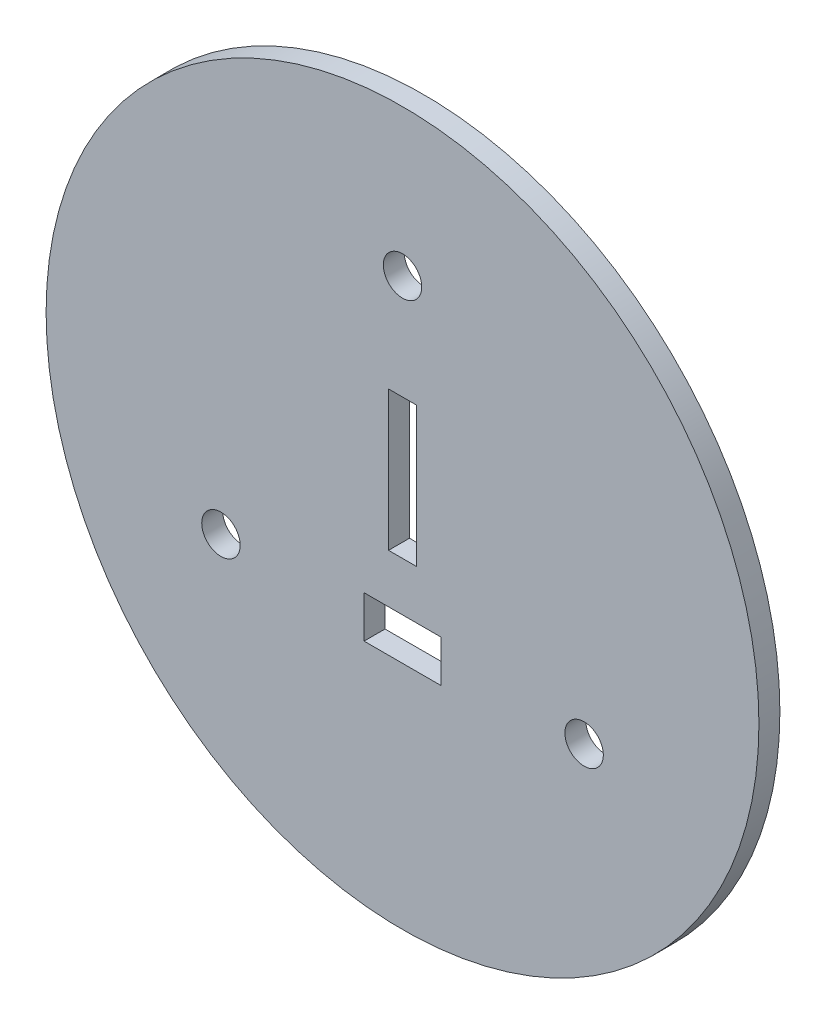
ISO-10303-21;
HEADER;
FILE_DESCRIPTION(('STEP AP214'),'2;1');
FILE_NAME('part.step','',(''),(''),'','','');
FILE_SCHEMA(('AUTOMOTIVE_DESIGN { 1 0 10303 214 1 1 1 1 }'));
ENDSEC;
DATA;
#1=APPLICATION_CONTEXT('core data for automotive mechanical design processes');
#2=APPLICATION_PROTOCOL_DEFINITION('international standard','automotive_design',2000,#1);
#3=PRODUCT_CONTEXT('',#1,'mechanical');
#4=PRODUCT('Part','Part','',(#3));
#5=PRODUCT_RELATED_PRODUCT_CATEGORY('part','',(#4));
#6=PRODUCT_DEFINITION_FORMATION('','',#4);
#7=PRODUCT_DEFINITION_CONTEXT('part definition',#1,'design');
#8=PRODUCT_DEFINITION('design','',#6,#7);
#9=PRODUCT_DEFINITION_SHAPE('','',#8);
#10=(LENGTH_UNIT() NAMED_UNIT(*) SI_UNIT(.MILLI.,.METRE.));
#11=(NAMED_UNIT(*) PLANE_ANGLE_UNIT() SI_UNIT($,.RADIAN.));
#12=(NAMED_UNIT(*) SI_UNIT($,.STERADIAN.) SOLID_ANGLE_UNIT());
#13=UNCERTAINTY_MEASURE_WITH_UNIT(LENGTH_MEASURE(1.E-05),#10,'distance_accuracy_value','');
#14=(GEOMETRIC_REPRESENTATION_CONTEXT(3) GLOBAL_UNCERTAINTY_ASSIGNED_CONTEXT((#13)) GLOBAL_UNIT_ASSIGNED_CONTEXT((#10,
#11,#12)) REPRESENTATION_CONTEXT('',''));
#15=CARTESIAN_POINT('',(0.,0.,0.));
#16=DIRECTION('',(0.,0.,1.));
#17=DIRECTION('',(1.,0.,0.));
#18=AXIS2_PLACEMENT_3D('',#15,#16,#17);
#19=CARTESIAN_POINT('',(0.,0.,3.));
#20=DIRECTION('',(0.,0.,-1.));
#21=DIRECTION('',(-1.,0.,0.));
#22=AXIS2_PLACEMENT_3D('',#19,#20,#21);
#23=CYLINDRICAL_SURFACE('',#22,51.);
#24=CARTESIAN_POINT('',(0.,0.,3.));
#25=DIRECTION('',(0.,0.,1.));
#26=DIRECTION('',(1.,0.,0.));
#27=AXIS2_PLACEMENT_3D('',#24,#25,#26);
#28=CIRCLE('',#27,51.);
#29=CARTESIAN_POINT('',(51.,0.,3.));
#30=VERTEX_POINT('',#29);
#31=EDGE_CURVE('E189',#30,#30,#28,.T.);
#32=ORIENTED_EDGE('',*,*,#31,.F.);
#33=EDGE_LOOP('',(#32));
#34=FACE_BOUND('',#33,.T.);
#35=CARTESIAN_POINT('',(0.,0.,0.));
#36=DIRECTION('',(0.,0.,1.));
#37=DIRECTION('',(1.,0.,0.));
#38=AXIS2_PLACEMENT_3D('',#35,#36,#37);
#39=CIRCLE('',#38,51.);
#40=CARTESIAN_POINT('',(51.,0.,0.));
#41=VERTEX_POINT('',#40);
#42=EDGE_CURVE('E185',#41,#41,#39,.T.);
#43=ORIENTED_EDGE('',*,*,#42,.T.);
#44=EDGE_LOOP('',(#43));
#45=FACE_BOUND('',#44,.T.);
#46=ADVANCED_FACE('F43',(#34,#45),#23,.T.);
#47=CARTESIAN_POINT('',(0.,0.,3.));
#48=DIRECTION('',(0.,0.,1.));
#49=DIRECTION('',(1.,0.,0.));
#50=AXIS2_PLACEMENT_3D('',#47,#48,#49);
#51=PLANE('',#50);
#52=DIRECTION('',(0.,1.,0.));
#53=VECTOR('',#52,1.);
#54=CARTESIAN_POINT('',(5.5,-18.0000000000001,3.));
#55=LINE('',#54,#53);
#56=CARTESIAN_POINT('',(5.5,-18.0000000000001,3.));
#57=VERTEX_POINT('',#56);
#58=CARTESIAN_POINT('',(5.5,-12.0000000000001,3.));
#59=VERTEX_POINT('',#58);
#60=EDGE_CURVE('E58',#57,#59,#55,.T.);
#61=ORIENTED_EDGE('',*,*,#60,.F.);
#62=DIRECTION('',(1.,0.,0.));
#63=VECTOR('',#62,1.);
#64=CARTESIAN_POINT('',(-5.5,-18.0000000000001,3.));
#65=LINE('',#64,#63);
#66=CARTESIAN_POINT('',(-5.5,-18.0000000000001,3.));
#67=VERTEX_POINT('',#66);
#68=EDGE_CURVE('E117',#67,#57,#65,.T.);
#69=ORIENTED_EDGE('',*,*,#68,.F.);
#70=DIRECTION('',(0.,-1.,0.));
#71=VECTOR('',#70,1.);
#72=CARTESIAN_POINT('',(-5.5,-18.0000000000001,3.));
#73=LINE('',#72,#71);
#74=CARTESIAN_POINT('',(-5.5,-12.0000000000001,3.));
#75=VERTEX_POINT('',#74);
#76=EDGE_CURVE('E124',#75,#67,#73,.T.);
#77=ORIENTED_EDGE('',*,*,#76,.F.);
#78=DIRECTION('',(-1.,0.,0.));
#79=VECTOR('',#78,1.);
#80=CARTESIAN_POINT('',(-5.5,-12.0000000000001,3.));
#81=LINE('',#80,#79);
#82=EDGE_CURVE('E131',#59,#75,#81,.T.);
#83=ORIENTED_EDGE('',*,*,#82,.F.);
#84=EDGE_LOOP('',(#61,#69,#77,#83));
#85=FACE_BOUND('',#84,.T.);
#86=DIRECTION('',(0.,1.,0.));
#87=VECTOR('',#86,1.);
#88=CARTESIAN_POINT('',(2.,-5.,3.));
#89=LINE('',#88,#87);
#90=CARTESIAN_POINT('',(2.,-5.,3.));
#91=VERTEX_POINT('',#90);
#92=CARTESIAN_POINT('',(2.,15.,3.));
#93=VERTEX_POINT('',#92);
#94=EDGE_CURVE('E66',#91,#93,#89,.T.);
#95=ORIENTED_EDGE('',*,*,#94,.F.);
#96=DIRECTION('',(1.,0.,0.));
#97=VECTOR('',#96,1.);
#98=CARTESIAN_POINT('',(-2.,-5.,3.));
#99=LINE('',#98,#97);
#100=CARTESIAN_POINT('',(-2.,-5.,3.));
#101=VERTEX_POINT('',#100);
#102=EDGE_CURVE('E148',#101,#91,#99,.T.);
#103=ORIENTED_EDGE('',*,*,#102,.F.);
#104=DIRECTION('',(0.,-1.,0.));
#105=VECTOR('',#104,1.);
#106=CARTESIAN_POINT('',(-2.,-5.,3.));
#107=LINE('',#106,#105);
#108=CARTESIAN_POINT('',(-2.,15.,3.));
#109=VERTEX_POINT('',#108);
#110=EDGE_CURVE('E144',#109,#101,#107,.T.);
#111=ORIENTED_EDGE('',*,*,#110,.F.);
#112=DIRECTION('',(-1.,0.,0.));
#113=VECTOR('',#112,1.);
#114=CARTESIAN_POINT('',(-2.,15.,3.));
#115=LINE('',#114,#113);
#116=EDGE_CURVE('E136',#93,#109,#115,.T.);
#117=ORIENTED_EDGE('',*,*,#116,.F.);
#118=EDGE_LOOP('',(#95,#103,#111,#117));
#119=FACE_BOUND('',#118,.T.);
#120=CARTESIAN_POINT('',(-25.9807621135331,-15.0000000000001,3.));
#121=DIRECTION('',(0.,0.,-1.));
#122=DIRECTION('',(0.500000000000004,-0.866025403784436,0.));
#123=AXIS2_PLACEMENT_3D('',#120,#121,#122);
#124=CIRCLE('',#123,2.75);
#125=CARTESIAN_POINT('',(-24.6057621135331,-17.3815698604073,3.));
#126=VERTEX_POINT('',#125);
#127=EDGE_CURVE('E165',#126,#126,#124,.T.);
#128=ORIENTED_EDGE('',*,*,#127,.T.);
#129=EDGE_LOOP('',(#128));
#130=FACE_BOUND('',#129,.T.);
#131=CARTESIAN_POINT('',(25.9807621135333,-14.9999999999998,3.));
#132=DIRECTION('',(0.,0.,-1.));
#133=DIRECTION('',(0.499999999999992,0.866025403784443,0.));
#134=AXIS2_PLACEMENT_3D('',#131,#132,#133);
#135=CIRCLE('',#134,2.75);
#136=CARTESIAN_POINT('',(27.3557621135333,-12.6184301395925,3.));
#137=VERTEX_POINT('',#136);
#138=EDGE_CURVE('E174',#137,#137,#135,.T.);
#139=ORIENTED_EDGE('',*,*,#138,.T.);
#140=EDGE_LOOP('',(#139));
#141=FACE_BOUND('',#140,.T.);
#142=CARTESIAN_POINT('',(0.,30.,3.));
#143=DIRECTION('',(0.,0.,-1.));
#144=DIRECTION('',(-1.,0.,0.));
#145=AXIS2_PLACEMENT_3D('',#142,#143,#144);
#146=CIRCLE('',#145,2.75);
#147=CARTESIAN_POINT('',(-2.75,30.,3.));
#148=VERTEX_POINT('',#147);
#149=EDGE_CURVE('E181',#148,#148,#146,.T.);
#150=ORIENTED_EDGE('',*,*,#149,.T.);
#151=EDGE_LOOP('',(#150));
#152=FACE_BOUND('',#151,.T.);
#153=ORIENTED_EDGE('',*,*,#31,.T.);
#154=EDGE_LOOP('',(#153));
#155=FACE_BOUND('',#154,.T.);
#156=ADVANCED_FACE('F128',(#85,#119,#130,#141,#152,#155),#51,.T.);
#157=CARTESIAN_POINT('',(0.,0.,0.));
#158=DIRECTION('',(0.,0.,1.));
#159=DIRECTION('',(1.,0.,0.));
#160=AXIS2_PLACEMENT_3D('',#157,#158,#159);
#161=PLANE('',#160);
#162=DIRECTION('',(1.,0.,0.));
#163=VECTOR('',#162,1.);
#164=CARTESIAN_POINT('',(0.,-18.0000000000001,0.));
#165=LINE('',#164,#163);
#166=CARTESIAN_POINT('',(-5.5,-18.0000000000001,0.));
#167=VERTEX_POINT('',#166);
#168=CARTESIAN_POINT('',(5.5,-18.0000000000001,0.));
#169=VERTEX_POINT('',#168);
#170=EDGE_CURVE('E51',#167,#169,#165,.T.);
#171=ORIENTED_EDGE('',*,*,#170,.T.);
#172=DIRECTION('',(0.,1.,0.));
#173=VECTOR('',#172,1.);
#174=CARTESIAN_POINT('',(5.5,0.,0.));
#175=LINE('',#174,#173);
#176=CARTESIAN_POINT('',(5.5,-12.0000000000001,0.));
#177=VERTEX_POINT('',#176);
#178=EDGE_CURVE('E11',#169,#177,#175,.T.);
#179=ORIENTED_EDGE('',*,*,#178,.T.);
#180=DIRECTION('',(-1.,0.,0.));
#181=VECTOR('',#180,1.);
#182=CARTESIAN_POINT('',(0.,-12.0000000000001,0.));
#183=LINE('',#182,#181);
#184=CARTESIAN_POINT('',(-5.5,-12.0000000000001,0.));
#185=VERTEX_POINT('',#184);
#186=EDGE_CURVE('E212',#177,#185,#183,.T.);
#187=ORIENTED_EDGE('',*,*,#186,.T.);
#188=DIRECTION('',(0.,-1.,0.));
#189=VECTOR('',#188,1.);
#190=CARTESIAN_POINT('',(-5.5,0.,0.));
#191=LINE('',#190,#189);
#192=EDGE_CURVE('E216',#185,#167,#191,.T.);
#193=ORIENTED_EDGE('',*,*,#192,.T.);
#194=EDGE_LOOP('',(#171,#179,#187,#193));
#195=FACE_BOUND('',#194,.T.);
#196=DIRECTION('',(1.,0.,0.));
#197=VECTOR('',#196,1.);
#198=CARTESIAN_POINT('',(0.,-5.,0.));
#199=LINE('',#198,#197);
#200=CARTESIAN_POINT('',(-2.,-5.,0.));
#201=VERTEX_POINT('',#200);
#202=CARTESIAN_POINT('',(2.,-5.,0.));
#203=VERTEX_POINT('',#202);
#204=EDGE_CURVE('E204',#201,#203,#199,.T.);
#205=ORIENTED_EDGE('',*,*,#204,.T.);
#206=DIRECTION('',(0.,1.,0.));
#207=VECTOR('',#206,1.);
#208=CARTESIAN_POINT('',(2.,0.,0.));
#209=LINE('',#208,#207);
#210=CARTESIAN_POINT('',(2.,15.,0.));
#211=VERTEX_POINT('',#210);
#212=EDGE_CURVE('E208',#203,#211,#209,.T.);
#213=ORIENTED_EDGE('',*,*,#212,.T.);
#214=DIRECTION('',(-1.,0.,0.));
#215=VECTOR('',#214,1.);
#216=CARTESIAN_POINT('',(0.,15.,0.));
#217=LINE('',#216,#215);
#218=CARTESIAN_POINT('',(-2.,15.,0.));
#219=VERTEX_POINT('',#218);
#220=EDGE_CURVE('E193',#211,#219,#217,.T.);
#221=ORIENTED_EDGE('',*,*,#220,.T.);
#222=DIRECTION('',(0.,-1.,0.));
#223=VECTOR('',#222,1.);
#224=CARTESIAN_POINT('',(-2.,0.,0.));
#225=LINE('',#224,#223);
#226=EDGE_CURVE('E200',#219,#201,#225,.T.);
#227=ORIENTED_EDGE('',*,*,#226,.T.);
#228=EDGE_LOOP('',(#205,#213,#221,#227));
#229=FACE_BOUND('',#228,.T.);
#230=CARTESIAN_POINT('',(-25.9807621135331,-15.0000000000001,0.));
#231=DIRECTION('',(0.,0.,-1.));
#232=DIRECTION('',(0.500000000000004,-0.866025403784436,0.));
#233=AXIS2_PLACEMENT_3D('',#230,#231,#232);
#234=CIRCLE('',#233,2.75);
#235=CARTESIAN_POINT('',(-24.6057621135331,-17.3815698604073,0.));
#236=VERTEX_POINT('',#235);
#237=EDGE_CURVE('E170',#236,#236,#234,.T.);
#238=ORIENTED_EDGE('',*,*,#237,.F.);
#239=EDGE_LOOP('',(#238));
#240=FACE_BOUND('',#239,.T.);
#241=CARTESIAN_POINT('',(25.9807621135333,-14.9999999999998,0.));
#242=DIRECTION('',(0.,0.,-1.));
#243=DIRECTION('',(0.499999999999992,0.866025403784443,0.));
#244=AXIS2_PLACEMENT_3D('',#241,#242,#243);
#245=CIRCLE('',#244,2.75);
#246=CARTESIAN_POINT('',(27.3557621135333,-12.6184301395925,0.));
#247=VERTEX_POINT('',#246);
#248=EDGE_CURVE('E156',#247,#247,#245,.T.);
#249=ORIENTED_EDGE('',*,*,#248,.F.);
#250=EDGE_LOOP('',(#249));
#251=FACE_BOUND('',#250,.T.);
#252=CARTESIAN_POINT('',(0.,30.,0.));
#253=DIRECTION('',(0.,0.,-1.));
#254=DIRECTION('',(-1.,0.,0.));
#255=AXIS2_PLACEMENT_3D('',#252,#253,#254);
#256=CIRCLE('',#255,2.75);
#257=CARTESIAN_POINT('',(-2.75,30.,0.));
#258=VERTEX_POINT('',#257);
#259=EDGE_CURVE('E169',#258,#258,#256,.T.);
#260=ORIENTED_EDGE('',*,*,#259,.F.);
#261=EDGE_LOOP('',(#260));
#262=FACE_BOUND('',#261,.T.);
#263=ORIENTED_EDGE('',*,*,#42,.F.);
#264=EDGE_LOOP('',(#263));
#265=FACE_BOUND('',#264,.T.);
#266=ADVANCED_FACE('F221',(#195,#229,#240,#251,#262,#265),#161,.F.);
#267=CARTESIAN_POINT('',(0.,30.,3.));
#268=DIRECTION('',(0.,0.,-1.));
#269=DIRECTION('',(-1.,0.,0.));
#270=AXIS2_PLACEMENT_3D('',#267,#268,#269);
#271=CYLINDRICAL_SURFACE('',#270,2.75);
#272=ORIENTED_EDGE('',*,*,#149,.F.);
#273=EDGE_LOOP('',(#272));
#274=FACE_BOUND('',#273,.T.);
#275=ORIENTED_EDGE('',*,*,#259,.T.);
#276=EDGE_LOOP('',(#275));
#277=FACE_BOUND('',#276,.T.);
#278=ADVANCED_FACE('F254',(#274,#277),#271,.F.);
#279=CARTESIAN_POINT('',(25.9807621135333,-14.9999999999998,3.));
#280=DIRECTION('',(0.,0.,-1.));
#281=DIRECTION('',(-1.,0.,0.));
#282=AXIS2_PLACEMENT_3D('',#279,#280,#281);
#283=CYLINDRICAL_SURFACE('',#282,2.75);
#284=ORIENTED_EDGE('',*,*,#138,.F.);
#285=EDGE_LOOP('',(#284));
#286=FACE_BOUND('',#285,.T.);
#287=ORIENTED_EDGE('',*,*,#248,.T.);
#288=EDGE_LOOP('',(#287));
#289=FACE_BOUND('',#288,.T.);
#290=ADVANCED_FACE('F258',(#286,#289),#283,.F.);
#291=CARTESIAN_POINT('',(-25.9807621135331,-15.0000000000001,3.));
#292=DIRECTION('',(0.,0.,-1.));
#293=DIRECTION('',(-1.,0.,0.));
#294=AXIS2_PLACEMENT_3D('',#291,#292,#293);
#295=CYLINDRICAL_SURFACE('',#294,2.75);
#296=ORIENTED_EDGE('',*,*,#127,.F.);
#297=EDGE_LOOP('',(#296));
#298=FACE_BOUND('',#297,.T.);
#299=ORIENTED_EDGE('',*,*,#237,.T.);
#300=EDGE_LOOP('',(#299));
#301=FACE_BOUND('',#300,.T.);
#302=ADVANCED_FACE('F264',(#298,#301),#295,.F.);
#303=CARTESIAN_POINT('',(2.,-5.,-10.3));
#304=DIRECTION('',(1.,0.,0.));
#305=DIRECTION('',(0.,0.,-1.));
#306=AXIS2_PLACEMENT_3D('',#303,#304,#305);
#307=PLANE('',#306);
#308=DIRECTION('',(0.,0.,1.));
#309=VECTOR('',#308,1.);
#310=CARTESIAN_POINT('',(2.,-5.,-10.3));
#311=LINE('',#310,#309);
#312=EDGE_CURVE('E153',#203,#91,#311,.T.);
#313=ORIENTED_EDGE('',*,*,#312,.T.);
#314=ORIENTED_EDGE('',*,*,#94,.T.);
#315=DIRECTION('',(0.,0.,1.));
#316=VECTOR('',#315,1.);
#317=CARTESIAN_POINT('',(2.,15.,-10.3));
#318=LINE('',#317,#316);
#319=EDGE_CURVE('E152',#211,#93,#318,.T.);
#320=ORIENTED_EDGE('',*,*,#319,.F.);
#321=ORIENTED_EDGE('',*,*,#212,.F.);
#322=EDGE_LOOP('',(#313,#314,#320,#321));
#323=FACE_BOUND('',#322,.T.);
#324=ADVANCED_FACE('F268',(#323),#307,.F.);
#325=CARTESIAN_POINT('',(-2.,-5.,-10.3));
#326=DIRECTION('',(0.,-1.,0.));
#327=DIRECTION('',(0.,0.,-1.));
#328=AXIS2_PLACEMENT_3D('',#325,#326,#327);
#329=PLANE('',#328);
#330=DIRECTION('',(0.,0.,1.));
#331=VECTOR('',#330,1.);
#332=CARTESIAN_POINT('',(-2.,-5.,-10.3));
#333=LINE('',#332,#331);
#334=EDGE_CURVE('E157',#201,#101,#333,.T.);
#335=ORIENTED_EDGE('',*,*,#334,.T.);
#336=ORIENTED_EDGE('',*,*,#102,.T.);
#337=ORIENTED_EDGE('',*,*,#312,.F.);
#338=ORIENTED_EDGE('',*,*,#204,.F.);
#339=EDGE_LOOP('',(#335,#336,#337,#338));
#340=FACE_BOUND('',#339,.T.);
#341=ADVANCED_FACE('F272',(#340),#329,.F.);
#342=CARTESIAN_POINT('',(-2.,-5.,-10.3));
#343=DIRECTION('',(-1.,0.,0.));
#344=DIRECTION('',(0.,0.,1.));
#345=AXIS2_PLACEMENT_3D('',#342,#343,#344);
#346=PLANE('',#345);
#347=DIRECTION('',(0.,0.,1.));
#348=VECTOR('',#347,1.);
#349=CARTESIAN_POINT('',(-2.,15.,-10.3));
#350=LINE('',#349,#348);
#351=EDGE_CURVE('E160',#219,#109,#350,.T.);
#352=ORIENTED_EDGE('',*,*,#351,.T.);
#353=ORIENTED_EDGE('',*,*,#110,.T.);
#354=ORIENTED_EDGE('',*,*,#334,.F.);
#355=ORIENTED_EDGE('',*,*,#226,.F.);
#356=EDGE_LOOP('',(#352,#353,#354,#355));
#357=FACE_BOUND('',#356,.T.);
#358=ADVANCED_FACE('F276',(#357),#346,.F.);
#359=CARTESIAN_POINT('',(-2.,15.,-10.3));
#360=DIRECTION('',(0.,1.,0.));
#361=DIRECTION('',(0.,0.,1.));
#362=AXIS2_PLACEMENT_3D('',#359,#360,#361);
#363=PLANE('',#362);
#364=ORIENTED_EDGE('',*,*,#319,.T.);
#365=ORIENTED_EDGE('',*,*,#116,.T.);
#366=ORIENTED_EDGE('',*,*,#351,.F.);
#367=ORIENTED_EDGE('',*,*,#220,.F.);
#368=EDGE_LOOP('',(#364,#365,#366,#367));
#369=FACE_BOUND('',#368,.T.);
#370=ADVANCED_FACE('F273',(#369),#363,.F.);
#371=CARTESIAN_POINT('',(5.5,-18.0000000000001,-10.3));
#372=DIRECTION('',(1.,0.,0.));
#373=DIRECTION('',(0.,0.,-1.));
#374=AXIS2_PLACEMENT_3D('',#371,#372,#373);
#375=PLANE('',#374);
#376=DIRECTION('',(0.,0.,1.));
#377=VECTOR('',#376,1.);
#378=CARTESIAN_POINT('',(5.5,-18.0000000000001,-10.3));
#379=LINE('',#378,#377);
#380=EDGE_CURVE('E108',#169,#57,#379,.T.);
#381=ORIENTED_EDGE('',*,*,#380,.T.);
#382=ORIENTED_EDGE('',*,*,#60,.T.);
#383=DIRECTION('',(0.,0.,1.));
#384=VECTOR('',#383,1.);
#385=CARTESIAN_POINT('',(5.5,-12.0000000000001,-10.3));
#386=LINE('',#385,#384);
#387=EDGE_CURVE('E125',#177,#59,#386,.T.);
#388=ORIENTED_EDGE('',*,*,#387,.F.);
#389=ORIENTED_EDGE('',*,*,#178,.F.);
#390=EDGE_LOOP('',(#381,#382,#388,#389));
#391=FACE_BOUND('',#390,.T.);
#392=ADVANCED_FACE('F110',(#391),#375,.F.);
#393=CARTESIAN_POINT('',(-5.5,-18.0000000000001,-10.3));
#394=DIRECTION('',(0.,-1.,0.));
#395=DIRECTION('',(0.,0.,-1.));
#396=AXIS2_PLACEMENT_3D('',#393,#394,#395);
#397=PLANE('',#396);
#398=DIRECTION('',(0.,0.,1.));
#399=VECTOR('',#398,1.);
#400=CARTESIAN_POINT('',(-5.5,-18.0000000000001,-10.3));
#401=LINE('',#400,#399);
#402=EDGE_CURVE('E114',#167,#67,#401,.T.);
#403=ORIENTED_EDGE('',*,*,#402,.T.);
#404=ORIENTED_EDGE('',*,*,#68,.T.);
#405=ORIENTED_EDGE('',*,*,#380,.F.);
#406=ORIENTED_EDGE('',*,*,#170,.F.);
#407=EDGE_LOOP('',(#403,#404,#405,#406));
#408=FACE_BOUND('',#407,.T.);
#409=ADVANCED_FACE('F118',(#408),#397,.F.);
#410=CARTESIAN_POINT('',(-5.5,-18.0000000000001,-10.3));
#411=DIRECTION('',(-1.,0.,0.));
#412=DIRECTION('',(0.,0.,1.));
#413=AXIS2_PLACEMENT_3D('',#410,#411,#412);
#414=PLANE('',#413);
#415=DIRECTION('',(0.,0.,1.));
#416=VECTOR('',#415,1.);
#417=CARTESIAN_POINT('',(-5.5,-12.0000000000001,-10.3));
#418=LINE('',#417,#416);
#419=EDGE_CURVE('E227',#185,#75,#418,.T.);
#420=ORIENTED_EDGE('',*,*,#419,.T.);
#421=ORIENTED_EDGE('',*,*,#76,.T.);
#422=ORIENTED_EDGE('',*,*,#402,.F.);
#423=ORIENTED_EDGE('',*,*,#192,.F.);
#424=EDGE_LOOP('',(#420,#421,#422,#423));
#425=FACE_BOUND('',#424,.T.);
#426=ADVANCED_FACE('F225',(#425),#414,.F.);
#427=CARTESIAN_POINT('',(-5.5,-12.0000000000001,-10.3));
#428=DIRECTION('',(0.,1.,0.));
#429=DIRECTION('',(0.,0.,1.));
#430=AXIS2_PLACEMENT_3D('',#427,#428,#429);
#431=PLANE('',#430);
#432=ORIENTED_EDGE('',*,*,#387,.T.);
#433=ORIENTED_EDGE('',*,*,#82,.T.);
#434=ORIENTED_EDGE('',*,*,#419,.F.);
#435=ORIENTED_EDGE('',*,*,#186,.F.);
#436=EDGE_LOOP('',(#432,#433,#434,#435));
#437=FACE_BOUND('',#436,.T.);
#438=ADVANCED_FACE('F235',(#437),#431,.F.);
#439=CLOSED_SHELL('',(#46,#156,#266,#278,#290,#302,#324,#341,#358,#370,#392,#409,#426,#438));
#440=MANIFOLD_SOLID_BREP('B2',#439);
#441=ADVANCED_BREP_SHAPE_REPRESENTATION('',(#18,#440),#14);
#442=SHAPE_DEFINITION_REPRESENTATION(#9,#441);
ENDSEC;
END-ISO-10303-21;
